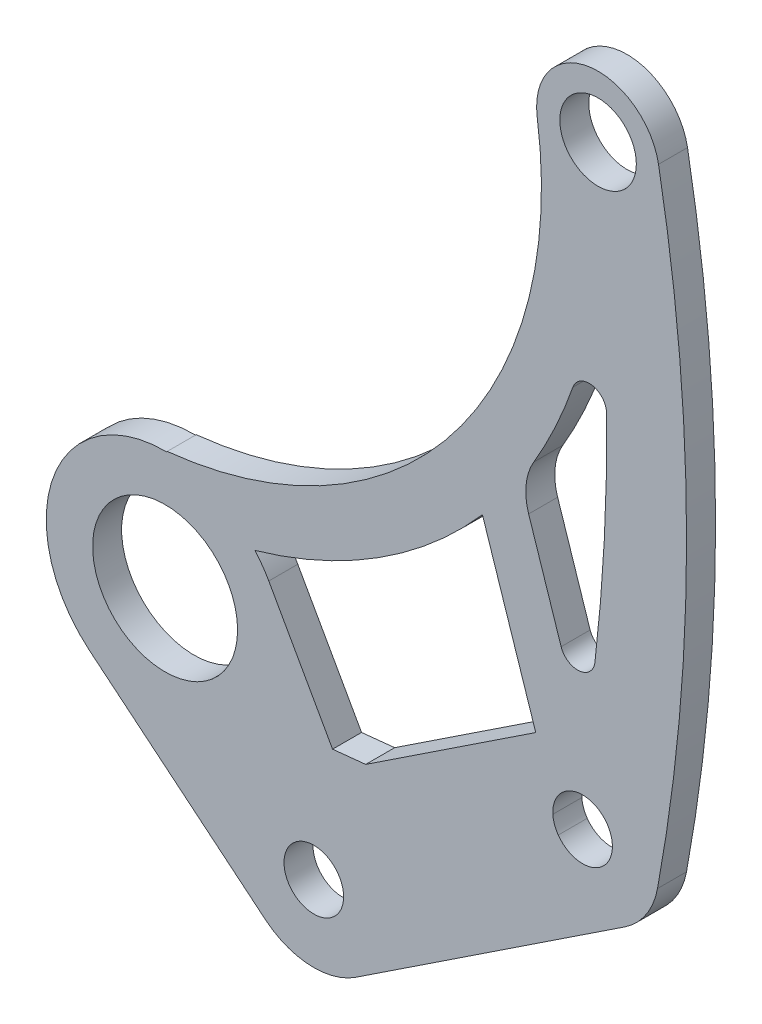
ISO-10303-21;
HEADER;
FILE_DESCRIPTION(('STEP AP214'),'2;1');
FILE_NAME('part.step','',(''),(''),'','','');
FILE_SCHEMA(('AUTOMOTIVE_DESIGN { 1 0 10303 214 1 1 1 1 }'));
ENDSEC;
DATA;
#1=APPLICATION_CONTEXT('core data for automotive mechanical design processes');
#2=APPLICATION_PROTOCOL_DEFINITION('international standard','automotive_design',2000,#1);
#3=PRODUCT_CONTEXT('',#1,'mechanical');
#4=PRODUCT('Part','Part','',(#3));
#5=PRODUCT_RELATED_PRODUCT_CATEGORY('part','',(#4));
#6=PRODUCT_DEFINITION_FORMATION('','',#4);
#7=PRODUCT_DEFINITION_CONTEXT('part definition',#1,'design');
#8=PRODUCT_DEFINITION('design','',#6,#7);
#9=PRODUCT_DEFINITION_SHAPE('','',#8);
#10=(LENGTH_UNIT() NAMED_UNIT(*) SI_UNIT(.MILLI.,.METRE.));
#11=(NAMED_UNIT(*) PLANE_ANGLE_UNIT() SI_UNIT($,.RADIAN.));
#12=(NAMED_UNIT(*) SI_UNIT($,.STERADIAN.) SOLID_ANGLE_UNIT());
#13=UNCERTAINTY_MEASURE_WITH_UNIT(LENGTH_MEASURE(1.E-05),#10,'distance_accuracy_value','');
#14=(GEOMETRIC_REPRESENTATION_CONTEXT(3) GLOBAL_UNCERTAINTY_ASSIGNED_CONTEXT((#13)) GLOBAL_UNIT_ASSIGNED_CONTEXT((#10,
#11,#12)) REPRESENTATION_CONTEXT('',''));
#15=CARTESIAN_POINT('',(0.,0.,0.));
#16=DIRECTION('',(0.,0.,1.));
#17=DIRECTION('',(1.,0.,0.));
#18=AXIS2_PLACEMENT_3D('',#15,#16,#17);
#19=CARTESIAN_POINT('',(45.72,0.,3.175));
#20=DIRECTION('',(0.,0.,-1.));
#21=DIRECTION('',(-1.,0.,0.));
#22=AXIS2_PLACEMENT_3D('',#19,#20,#21);
#23=CYLINDRICAL_SURFACE('',#22,3.2639);
#24=CARTESIAN_POINT('',(45.72,0.,0.));
#25=DIRECTION('',(0.,0.,1.));
#26=DIRECTION('',(1.,0.,0.));
#27=AXIS2_PLACEMENT_3D('',#24,#25,#26);
#28=CIRCLE('',#27,3.2639);
#29=CARTESIAN_POINT('',(42.4625763798194,-0.205510507492002,0.));
#30=VERTEX_POINT('',#29);
#31=CARTESIAN_POINT('',(43.0519360241002,-1.88002069948861,0.));
#32=VERTEX_POINT('',#31);
#33=EDGE_CURVE('E376',#30,#32,#28,.T.);
#34=ORIENTED_EDGE('',*,*,#33,.F.);
#35=DIRECTION('',(0.,0.,1.));
#36=VECTOR('',#35,1.);
#37=CARTESIAN_POINT('',(42.4625763798194,-0.205510507492002,3.175));
#38=LINE('',#37,#36);
#39=CARTESIAN_POINT('',(42.4625763798194,-0.205510507492002,3.175));
#40=VERTEX_POINT('',#39);
#41=EDGE_CURVE('E460',#30,#40,#38,.T.);
#42=ORIENTED_EDGE('',*,*,#41,.T.);
#43=CARTESIAN_POINT('',(45.72,0.,3.175));
#44=DIRECTION('',(0.,0.,1.));
#45=DIRECTION('',(1.,0.,0.));
#46=AXIS2_PLACEMENT_3D('',#43,#44,#45);
#47=CIRCLE('',#46,3.2639);
#48=CARTESIAN_POINT('',(43.0519360241002,-1.88002069948861,3.175));
#49=VERTEX_POINT('',#48);
#50=EDGE_CURVE('E293',#40,#49,#47,.T.);
#51=ORIENTED_EDGE('',*,*,#50,.T.);
#52=DIRECTION('',(0.,0.,1.));
#53=VECTOR('',#52,1.);
#54=CARTESIAN_POINT('',(43.0519360241002,-1.88002069948861,3.175));
#55=LINE('',#54,#53);
#56=EDGE_CURVE('E424',#32,#49,#55,.T.);
#57=ORIENTED_EDGE('',*,*,#56,.F.);
#58=EDGE_LOOP('',(#34,#42,#51,#57));
#59=FACE_BOUND('',#58,.T.);
#60=ADVANCED_FACE('F51',(#59),#23,.F.);
#61=CARTESIAN_POINT('',(48.9774236201806,0.205510507492002,3.175));
#62=VERTEX_POINT('',#61);
#63=EDGE_CURVE('E294',#49,#62,#47,.T.);
#64=ORIENTED_EDGE('',*,*,#63,.T.);
#65=DIRECTION('',(0.,0.,-1.));
#66=VECTOR('',#65,1.);
#67=CARTESIAN_POINT('',(48.9774236201806,0.205510507492002,3.175));
#68=LINE('',#67,#66);
#69=CARTESIAN_POINT('',(48.9774236201806,0.205510507492002,0.));
#70=VERTEX_POINT('',#69);
#71=EDGE_CURVE('E457',#62,#70,#68,.T.);
#72=ORIENTED_EDGE('',*,*,#71,.T.);
#73=EDGE_CURVE('E377',#32,#70,#28,.T.);
#74=ORIENTED_EDGE('',*,*,#73,.F.);
#75=ORIENTED_EDGE('',*,*,#56,.T.);
#76=EDGE_LOOP('',(#64,#72,#74,#75));
#77=FACE_BOUND('',#76,.T.);
#78=ADVANCED_FACE('F523',(#77),#23,.F.);
#79=ORIENTED_EDGE('',*,*,#71,.F.);
#80=CARTESIAN_POINT('',(48.3880639758998,1.88002069948861,3.175));
#81=VERTEX_POINT('',#80);
#82=EDGE_CURVE('E299',#62,#81,#47,.T.);
#83=ORIENTED_EDGE('',*,*,#82,.T.);
#84=DIRECTION('',(0.,0.,-1.));
#85=VECTOR('',#84,1.);
#86=CARTESIAN_POINT('',(48.3880639758998,1.88002069948861,3.175));
#87=LINE('',#86,#85);
#88=CARTESIAN_POINT('',(48.3880639758998,1.88002069948861,0.));
#89=VERTEX_POINT('',#88);
#90=EDGE_CURVE('E453',#81,#89,#87,.T.);
#91=ORIENTED_EDGE('',*,*,#90,.T.);
#92=EDGE_CURVE('E382',#70,#89,#28,.T.);
#93=ORIENTED_EDGE('',*,*,#92,.F.);
#94=EDGE_LOOP('',(#79,#83,#91,#93));
#95=FACE_BOUND('',#94,.T.);
#96=ADVANCED_FACE('F528',(#95),#23,.F.);
#97=CARTESIAN_POINT('',(-142.138533342949,38.656045003802,3.175));
#98=DIRECTION('',(0.,0.,-1.));
#99=DIRECTION('',(-1.,0.,0.));
#100=AXIS2_PLACEMENT_3D('',#97,#98,#99);
#101=CYLINDRICAL_SURFACE('',#100,190.5);
#102=CARTESIAN_POINT('',(-142.138533342949,38.656045003802,0.));
#103=DIRECTION('',(0.,0.,1.));
#104=DIRECTION('',(1.,0.,0.));
#105=AXIS2_PLACEMENT_3D('',#102,#103,#104);
#106=CIRCLE('',#105,190.5);
#107=CARTESIAN_POINT('',(47.0702030784157,16.5132343910918,0.));
#108=VERTEX_POINT('',#107);
#109=CARTESIAN_POINT('',(48.3497321227549,40.7704526909221,0.));
#110=VERTEX_POINT('',#109);
#111=EDGE_CURVE('E381',#108,#110,#106,.T.);
#112=ORIENTED_EDGE('',*,*,#111,.F.);
#113=DIRECTION('',(0.,0.,-1.));
#114=VECTOR('',#113,1.);
#115=CARTESIAN_POINT('',(47.0702030784158,16.5132343910918,3.175));
#116=LINE('',#115,#114);
#117=CARTESIAN_POINT('',(47.0702030784157,16.5132343910918,3.175));
#118=VERTEX_POINT('',#117);
#119=EDGE_CURVE('E471',#108,#118,#116,.F.);
#120=ORIENTED_EDGE('',*,*,#119,.T.);
#121=CARTESIAN_POINT('',(-142.138533342949,38.656045003802,3.175));
#122=DIRECTION('',(0.,0.,1.));
#123=DIRECTION('',(1.,0.,0.));
#124=AXIS2_PLACEMENT_3D('',#121,#122,#123);
#125=CIRCLE('',#124,190.5);
#126=CARTESIAN_POINT('',(48.3497321227549,40.7704526909221,3.175));
#127=VERTEX_POINT('',#126);
#128=EDGE_CURVE('E298',#118,#127,#125,.T.);
#129=ORIENTED_EDGE('',*,*,#128,.T.);
#130=DIRECTION('',(0.,0.,-1.));
#131=VECTOR('',#130,1.);
#132=CARTESIAN_POINT('',(48.3497321227549,40.7704526909221,3.175));
#133=LINE('',#132,#131);
#134=EDGE_CURVE('E467',#127,#110,#133,.T.);
#135=ORIENTED_EDGE('',*,*,#134,.T.);
#136=EDGE_LOOP('',(#112,#120,#129,#135));
#137=FACE_BOUND('',#136,.T.);
#138=ADVANCED_FACE('F583',(#137),#101,.F.);
#139=CARTESIAN_POINT('',(43.9242602583384,14.4500573911322,3.175));
#140=DIRECTION('',(0.949917524329056,0.312500715155273,0.));
#141=DIRECTION('',(-0.312500715155273,0.949917524329056,0.));
#142=AXIS2_PLACEMENT_3D('',#139,#140,#141);
#143=PLANE('',#142);
#144=DIRECTION('',(0.312500715155273,-0.949917524329056,0.));
#145=VECTOR('',#144,1.);
#146=CARTESIAN_POINT('',(43.9242602583384,14.4500573911322,0.));
#147=LINE('',#146,#145);
#148=CARTESIAN_POINT('',(39.8116959434713,26.9511389028385,0.));
#149=VERTEX_POINT('',#148);
#150=CARTESIAN_POINT('',(43.3685228303553,16.1393486348481,0.));
#151=VERTEX_POINT('',#150);
#152=EDGE_CURVE('E387',#149,#151,#147,.T.);
#153=ORIENTED_EDGE('',*,*,#152,.F.);
#154=DIRECTION('',(0.,0.,-1.));
#155=VECTOR('',#154,1.);
#156=CARTESIAN_POINT('',(39.8116959434713,26.9511389028385,3.175));
#157=LINE('',#156,#155);
#158=CARTESIAN_POINT('',(39.8116959434713,26.9511389028385,3.175));
#159=VERTEX_POINT('',#158);
#160=EDGE_CURVE('E73',#149,#159,#157,.F.);
#161=ORIENTED_EDGE('',*,*,#160,.T.);
#162=DIRECTION('',(0.312500715155273,-0.949917524329056,0.));
#163=VECTOR('',#162,1.);
#164=CARTESIAN_POINT('',(43.9242602583384,14.4500573911322,3.175));
#165=LINE('',#164,#163);
#166=CARTESIAN_POINT('',(43.3685228303553,16.1393486348481,3.175));
#167=VERTEX_POINT('',#166);
#168=EDGE_CURVE('E304',#159,#167,#165,.T.);
#169=ORIENTED_EDGE('',*,*,#168,.T.);
#170=DIRECTION('',(0.,0.,1.));
#171=VECTOR('',#170,1.);
#172=CARTESIAN_POINT('',(43.3685228303553,16.1393486348481,0.));
#173=LINE('',#172,#171);
#174=EDGE_CURVE('E463',#167,#151,#173,.F.);
#175=ORIENTED_EDGE('',*,*,#174,.T.);
#176=EDGE_LOOP('',(#153,#161,#169,#175));
#177=FACE_BOUND('',#176,.T.);
#178=ADVANCED_FACE('F586',(#177),#143,.T.);
#179=CARTESIAN_POINT('',(0.811388888888889,-7.89592010604133,3.175));
#180=DIRECTION('',(-0.102222222222222,0.994761588162687,0.));
#181=DIRECTION('',(-0.994761588162687,-0.102222222222222,0.));
#182=AXIS2_PLACEMENT_3D('',#179,#180,#181);
#183=PLANE('',#182);
#184=DIRECTION('',(0.994761588162687,0.102222222222222,0.));
#185=VECTOR('',#184,1.);
#186=CARTESIAN_POINT('',(0.811388888888889,-7.89592010604133,0.));
#187=LINE('',#186,#185);
#188=CARTESIAN_POINT('',(18.3396561244522,-6.09470617715044,0.));
#189=VERTEX_POINT('',#188);
#190=CARTESIAN_POINT('',(21.96746643693,-5.72191048785657,0.));
#191=VERTEX_POINT('',#190);
#192=EDGE_CURVE('E352',#189,#191,#187,.T.);
#193=ORIENTED_EDGE('',*,*,#192,.F.);
#194=DIRECTION('',(0.,0.,-1.));
#195=VECTOR('',#194,1.);
#196=CARTESIAN_POINT('',(18.3396561244522,-6.09470617715044,3.175));
#197=LINE('',#196,#195);
#198=CARTESIAN_POINT('',(18.3396561244522,-6.09470617715044,3.175));
#199=VERTEX_POINT('',#198);
#200=EDGE_CURVE('E421',#199,#189,#197,.T.);
#201=ORIENTED_EDGE('',*,*,#200,.F.);
#202=DIRECTION('',(0.994761588162687,0.102222222222222,0.));
#203=VECTOR('',#202,1.);
#204=CARTESIAN_POINT('',(0.811388888888889,-7.89592010604133,3.175));
#205=LINE('',#204,#203);
#206=CARTESIAN_POINT('',(21.96746643693,-5.72191048785657,3.175));
#207=VERTEX_POINT('',#206);
#208=EDGE_CURVE('E270',#199,#207,#205,.T.);
#209=ORIENTED_EDGE('',*,*,#208,.T.);
#210=DIRECTION('',(0.,0.,-1.));
#211=VECTOR('',#210,1.);
#212=CARTESIAN_POINT('',(21.96746643693,-5.72191048785657,3.175));
#213=LINE('',#212,#211);
#214=EDGE_CURVE('E240',#207,#191,#213,.T.);
#215=ORIENTED_EDGE('',*,*,#214,.T.);
#216=EDGE_LOOP('',(#193,#201,#209,#215));
#217=FACE_BOUND('',#216,.T.);
#218=ADVANCED_FACE('F592',(#217),#183,.T.);
#219=CARTESIAN_POINT('',(11.3551442971774,6.3652183183516,3.175));
#220=DIRECTION('',(0.872298390411173,0.488973944179112,0.));
#221=DIRECTION('',(-0.488973944179112,0.872298390411173,0.));
#222=AXIS2_PLACEMENT_3D('',#219,#220,#221);
#223=PLANE('',#222);
#224=DIRECTION('',(0.488973944179112,-0.872298390411173,0.));
#225=VECTOR('',#224,1.);
#226=CARTESIAN_POINT('',(11.3551442971774,6.3652183183516,0.));
#227=LINE('',#226,#225);
#228=CARTESIAN_POINT('',(11.3551442971774,6.3652183183516,0.));
#229=VERTEX_POINT('',#228);
#230=EDGE_CURVE('E356',#229,#189,#227,.T.);
#231=ORIENTED_EDGE('',*,*,#230,.F.);
#232=DIRECTION('',(0.,0.,-1.));
#233=VECTOR('',#232,1.);
#234=CARTESIAN_POINT('',(11.3551442971774,6.3652183183516,3.175));
#235=LINE('',#234,#233);
#236=CARTESIAN_POINT('',(11.3551442971774,6.3652183183516,3.175));
#237=VERTEX_POINT('',#236);
#238=EDGE_CURVE('E418',#237,#229,#235,.T.);
#239=ORIENTED_EDGE('',*,*,#238,.F.);
#240=DIRECTION('',(0.488973944179112,-0.872298390411173,0.));
#241=VECTOR('',#240,1.);
#242=CARTESIAN_POINT('',(11.3551442971774,6.3652183183516,3.175));
#243=LINE('',#242,#241);
#244=EDGE_CURVE('E274',#237,#199,#243,.T.);
#245=ORIENTED_EDGE('',*,*,#244,.T.);
#246=ORIENTED_EDGE('',*,*,#200,.T.);
#247=EDGE_LOOP('',(#231,#239,#245,#246));
#248=FACE_BOUND('',#247,.T.);
#249=ADVANCED_FACE('F702',(#248),#223,.T.);
#250=CARTESIAN_POINT('',(0.,0.,3.175));
#251=DIRECTION('',(0.,0.,-1.));
#252=DIRECTION('',(-1.,0.,0.));
#253=AXIS2_PLACEMENT_3D('',#250,#251,#252);
#254=CYLINDRICAL_SURFACE('',#253,13.0175);
#255=CARTESIAN_POINT('',(0.,0.,0.));
#256=DIRECTION('',(0.,0.,1.));
#257=DIRECTION('',(1.,0.,0.));
#258=AXIS2_PLACEMENT_3D('',#255,#256,#257);
#259=CIRCLE('',#258,13.0175);
#260=CARTESIAN_POINT('',(9.84885975052512,8.51206601621993,0.));
#261=VERTEX_POINT('',#260);
#262=EDGE_CURVE('E360',#229,#261,#259,.T.);
#263=ORIENTED_EDGE('',*,*,#262,.T.);
#264=DIRECTION('',(0.,0.,-1.));
#265=VECTOR('',#264,1.);
#266=CARTESIAN_POINT('',(9.84885975052512,8.51206601621993,3.175));
#267=LINE('',#266,#265);
#268=CARTESIAN_POINT('',(9.84885975052512,8.51206601621993,3.175));
#269=VERTEX_POINT('',#268);
#270=EDGE_CURVE('E414',#269,#261,#267,.T.);
#271=ORIENTED_EDGE('',*,*,#270,.F.);
#272=CARTESIAN_POINT('',(0.,0.,3.175));
#273=DIRECTION('',(0.,0.,1.));
#274=DIRECTION('',(1.,0.,0.));
#275=AXIS2_PLACEMENT_3D('',#272,#273,#274);
#276=CIRCLE('',#275,13.0175);
#277=EDGE_CURVE('E278',#237,#269,#276,.T.);
#278=ORIENTED_EDGE('',*,*,#277,.F.);
#279=ORIENTED_EDGE('',*,*,#238,.T.);
#280=EDGE_LOOP('',(#263,#271,#278,#279));
#281=FACE_BOUND('',#280,.T.);
#282=ADVANCED_FACE('F711',(#281),#254,.T.);
#283=CARTESIAN_POINT('',(-4.50533240745612,58.5644592406378,3.175));
#284=DIRECTION('',(0.,0.,-1.));
#285=DIRECTION('',(-1.,0.,0.));
#286=AXIS2_PLACEMENT_3D('',#283,#284,#285);
#287=CYLINDRICAL_SURFACE('',#286,52.07);
#288=CARTESIAN_POINT('',(-4.50533240745612,58.5644592406378,0.));
#289=DIRECTION('',(0.,0.,1.));
#290=DIRECTION('',(1.,0.,0.));
#291=AXIS2_PLACEMENT_3D('',#288,#289,#290);
#292=CIRCLE('',#291,52.07);
#293=CARTESIAN_POINT('',(34.7498990240676,24.3546403978332,0.));
#294=VERTEX_POINT('',#293);
#295=EDGE_CURVE('E364',#261,#294,#292,.T.);
#296=ORIENTED_EDGE('',*,*,#295,.T.);
#297=DIRECTION('',(0.,0.,-1.));
#298=VECTOR('',#297,1.);
#299=CARTESIAN_POINT('',(34.7498990240676,24.3546403978332,3.175));
#300=LINE('',#299,#298);
#301=CARTESIAN_POINT('',(34.7498990240676,24.3546403978332,3.175));
#302=VERTEX_POINT('',#301);
#303=EDGE_CURVE('E410',#302,#294,#300,.T.);
#304=ORIENTED_EDGE('',*,*,#303,.F.);
#305=CARTESIAN_POINT('',(-4.50533240745612,58.5644592406378,3.175));
#306=DIRECTION('',(0.,0.,1.));
#307=DIRECTION('',(1.,0.,0.));
#308=AXIS2_PLACEMENT_3D('',#305,#306,#307);
#309=CIRCLE('',#308,52.07);
#310=EDGE_CURVE('E282',#269,#302,#309,.T.);
#311=ORIENTED_EDGE('',*,*,#310,.F.);
#312=ORIENTED_EDGE('',*,*,#270,.T.);
#313=EDGE_LOOP('',(#296,#304,#311,#312));
#314=FACE_BOUND('',#313,.T.);
#315=ADVANCED_FACE('F721',(#314),#287,.T.);
#316=CARTESIAN_POINT('',(38.586011370491,12.6938979852854,3.175));
#317=DIRECTION('',(0.949917524329056,0.312500715155272,0.));
#318=DIRECTION('',(-0.312500715155272,0.949917524329057,0.));
#319=AXIS2_PLACEMENT_3D('',#316,#317,#318);
#320=PLANE('',#319);
#321=DIRECTION('',(0.312500715155272,-0.949917524329057,0.));
#322=VECTOR('',#321,1.);
#323=CARTESIAN_POINT('',(38.586011370491,12.6938979852854,0.));
#324=LINE('',#323,#322);
#325=CARTESIAN_POINT('',(40.5878173621273,6.60895001703049,0.));
#326=VERTEX_POINT('',#325);
#327=EDGE_CURVE('E368',#294,#326,#324,.T.);
#328=ORIENTED_EDGE('',*,*,#327,.T.);
#329=DIRECTION('',(0.,0.,-1.));
#330=VECTOR('',#329,1.);
#331=CARTESIAN_POINT('',(40.5878173621273,6.60895001703049,3.175));
#332=LINE('',#331,#330);
#333=CARTESIAN_POINT('',(40.5878173621273,6.60895001703049,3.175));
#334=VERTEX_POINT('',#333);
#335=EDGE_CURVE('E406',#334,#326,#332,.T.);
#336=ORIENTED_EDGE('',*,*,#335,.F.);
#337=DIRECTION('',(0.312500715155272,-0.949917524329057,0.));
#338=VECTOR('',#337,1.);
#339=CARTESIAN_POINT('',(38.586011370491,12.6938979852854,3.175));
#340=LINE('',#339,#338);
#341=EDGE_CURVE('E286',#302,#334,#340,.T.);
#342=ORIENTED_EDGE('',*,*,#341,.F.);
#343=ORIENTED_EDGE('',*,*,#303,.T.);
#344=EDGE_LOOP('',(#328,#336,#342,#343));
#345=FACE_BOUND('',#344,.T.);
#346=ADVANCED_FACE('F640',(#345),#320,.F.);
#347=CARTESIAN_POINT('',(16.2846569382907,-19.4928178671576,3.175));
#348=DIRECTION('',(0.,0.,-1.));
#349=DIRECTION('',(-1.,0.,0.));
#350=AXIS2_PLACEMENT_3D('',#347,#348,#349);
#351=CYLINDRICAL_SURFACE('',#350,8.3439);
#352=CARTESIAN_POINT('',(16.2846569382907,-19.4928178671576,0.));
#353=DIRECTION('',(0.,0.,1.));
#354=DIRECTION('',(1.,0.,0.));
#355=AXIS2_PLACEMENT_3D('',#352,#353,#354);
#356=CIRCLE('',#355,8.3439);
#357=CARTESIAN_POINT('',(10.974906006495,-25.9292153263187,0.));
#358=VERTEX_POINT('',#357);
#359=CARTESIAN_POINT('',(20.8916054969986,-26.4495909831518,0.));
#360=VERTEX_POINT('',#359);
#361=EDGE_CURVE('E235',#358,#360,#356,.T.);
#362=ORIENTED_EDGE('',*,*,#361,.T.);
#363=DIRECTION('',(0.,0.,-1.));
#364=VECTOR('',#363,1.);
#365=CARTESIAN_POINT('',(20.8916054969986,-26.4495909831518,3.175));
#366=LINE('',#365,#364);
#367=CARTESIAN_POINT('',(20.8916054969986,-26.4495909831518,3.175));
#368=VERTEX_POINT('',#367);
#369=EDGE_CURVE('E232',#368,#360,#366,.T.);
#370=ORIENTED_EDGE('',*,*,#369,.F.);
#371=CARTESIAN_POINT('',(16.2846569382907,-19.4928178671576,3.175));
#372=DIRECTION('',(0.,0.,1.));
#373=DIRECTION('',(1.,0.,0.));
#374=AXIS2_PLACEMENT_3D('',#371,#372,#373);
#375=CIRCLE('',#374,8.3439);
#376=CARTESIAN_POINT('',(10.974906006495,-25.9292153263187,3.175));
#377=VERTEX_POINT('',#376);
#378=EDGE_CURVE('E217',#377,#368,#375,.T.);
#379=ORIENTED_EDGE('',*,*,#378,.F.);
#380=DIRECTION('',(0.,0.,-1.));
#381=VECTOR('',#380,1.);
#382=CARTESIAN_POINT('',(10.974906006495,-25.9292153263187,3.175));
#383=LINE('',#382,#381);
#384=EDGE_CURVE('E322',#377,#358,#383,.T.);
#385=ORIENTED_EDGE('',*,*,#384,.T.);
#386=EDGE_LOOP('',(#362,#370,#379,#385));
#387=FACE_BOUND('',#386,.T.);
#388=ADVANCED_FACE('F233',(#387),#351,.T.);
#389=CARTESIAN_POINT('',(18.5447658322115,-28.0037267054097,3.175));
#390=DIRECTION('',(0.5521337214861,-0.833755571854191,0.));
#391=DIRECTION('',(0.833755571854191,0.5521337214861,0.));
#392=AXIS2_PLACEMENT_3D('',#389,#390,#391);
#393=PLANE('',#392);
#394=DIRECTION('',(-0.833755571854191,-0.5521337214861,0.));
#395=VECTOR('',#394,1.);
#396=CARTESIAN_POINT('',(18.5447658322115,-28.0037267054097,0.));
#397=LINE('',#396,#395);
#398=CARTESIAN_POINT('',(50.3269485587079,-6.95677311599419,0.));
#399=VERTEX_POINT('',#398);
#400=EDGE_CURVE('E325',#399,#360,#397,.T.);
#401=ORIENTED_EDGE('',*,*,#400,.F.);
#402=DIRECTION('',(0.,0.,-1.));
#403=VECTOR('',#402,1.);
#404=CARTESIAN_POINT('',(50.3269485587079,-6.95677311599419,3.175));
#405=LINE('',#404,#403);
#406=CARTESIAN_POINT('',(50.3269485587079,-6.95677311599419,3.175));
#407=VERTEX_POINT('',#406);
#408=EDGE_CURVE('E241',#407,#399,#405,.T.);
#409=ORIENTED_EDGE('',*,*,#408,.F.);
#410=DIRECTION('',(-0.833755571854191,-0.5521337214861,0.));
#411=VECTOR('',#410,1.);
#412=CARTESIAN_POINT('',(18.5447658322115,-28.0037267054097,3.175));
#413=LINE('',#412,#411);
#414=EDGE_CURVE('E222',#407,#368,#413,.T.);
#415=ORIENTED_EDGE('',*,*,#414,.T.);
#416=ORIENTED_EDGE('',*,*,#369,.T.);
#417=EDGE_LOOP('',(#401,#409,#415,#416));
#418=FACE_BOUND('',#417,.T.);
#419=ADVANCED_FACE('F243',(#418),#393,.T.);
#420=CARTESIAN_POINT('',(45.72,0.,3.175));
#421=DIRECTION('',(0.,0.,-1.));
#422=DIRECTION('',(-1.,0.,0.));
#423=AXIS2_PLACEMENT_3D('',#420,#421,#422);
#424=CYLINDRICAL_SURFACE('',#423,8.3439);
#425=CARTESIAN_POINT('',(45.72,0.,0.));
#426=DIRECTION('',(0.,0.,1.));
#427=DIRECTION('',(1.,0.,0.));
#428=AXIS2_PLACEMENT_3D('',#425,#426,#427);
#429=CIRCLE('',#428,8.3439);
#430=CARTESIAN_POINT('',(53.9245222927567,-1.51871036002841,0.));
#431=VERTEX_POINT('',#430);
#432=EDGE_CURVE('E328',#399,#431,#429,.T.);
#433=ORIENTED_EDGE('',*,*,#432,.T.);
#434=DIRECTION('',(0.,0.,-1.));
#435=VECTOR('',#434,1.);
#436=CARTESIAN_POINT('',(53.9245222927567,-1.51871036002841,3.175));
#437=LINE('',#436,#435);
#438=CARTESIAN_POINT('',(53.9245222927567,-1.51871036002841,3.175));
#439=VERTEX_POINT('',#438);
#440=EDGE_CURVE('E444',#439,#431,#437,.T.);
#441=ORIENTED_EDGE('',*,*,#440,.F.);
#442=CARTESIAN_POINT('',(45.72,0.,3.175));
#443=DIRECTION('',(0.,0.,1.));
#444=DIRECTION('',(1.,0.,0.));
#445=AXIS2_PLACEMENT_3D('',#442,#443,#444);
#446=CIRCLE('',#445,8.3439);
#447=EDGE_CURVE('E246',#407,#439,#446,.T.);
#448=ORIENTED_EDGE('',*,*,#447,.F.);
#449=ORIENTED_EDGE('',*,*,#408,.T.);
#450=EDGE_LOOP('',(#433,#441,#448,#449));
#451=FACE_BOUND('',#450,.T.);
#452=ADVANCED_FACE('F631',(#451),#424,.T.);
#453=CARTESIAN_POINT('',(-133.393338272466,33.1550421520357,3.175));
#454=DIRECTION('',(0.,0.,-1.));
#455=DIRECTION('',(-1.,0.,0.));
#456=AXIS2_PLACEMENT_3D('',#453,#454,#455);
#457=CYLINDRICAL_SURFACE('',#456,190.5);
#458=CARTESIAN_POINT('',(-133.393338272466,33.1550421520357,0.));
#459=DIRECTION('',(0.,0.,1.));
#460=DIRECTION('',(1.,0.,0.));
#461=AXIS2_PLACEMENT_3D('',#458,#459,#460);
#462=CIRCLE('',#461,190.5);
#463=CARTESIAN_POINT('',(54.0358306347205,67.2219857008992,0.));
#464=VERTEX_POINT('',#463);
#465=EDGE_CURVE('E331',#431,#464,#462,.T.);
#466=ORIENTED_EDGE('',*,*,#465,.T.);
#467=DIRECTION('',(0.,0.,-1.));
#468=VECTOR('',#467,1.);
#469=CARTESIAN_POINT('',(54.0358306347205,67.2219857008992,3.175));
#470=LINE('',#469,#468);
#471=CARTESIAN_POINT('',(54.0358306347205,67.2219857008992,3.175));
#472=VERTEX_POINT('',#471);
#473=EDGE_CURVE('E440',#472,#464,#470,.T.);
#474=ORIENTED_EDGE('',*,*,#473,.F.);
#475=CARTESIAN_POINT('',(-133.393338272466,33.1550421520357,3.175));
#476=DIRECTION('',(0.,0.,1.));
#477=DIRECTION('',(1.,0.,0.));
#478=AXIS2_PLACEMENT_3D('',#475,#476,#477);
#479=CIRCLE('',#478,190.5);
#480=EDGE_CURVE('E249',#439,#472,#479,.T.);
#481=ORIENTED_EDGE('',*,*,#480,.F.);
#482=ORIENTED_EDGE('',*,*,#440,.T.);
#483=EDGE_LOOP('',(#466,#474,#481,#482));
#484=FACE_BOUND('',#483,.T.);
#485=ADVANCED_FACE('F627',(#484),#457,.T.);
#486=CARTESIAN_POINT('',(47.4133333333333,66.0182870288394,3.175));
#487=DIRECTION('',(0.,0.,-1.));
#488=DIRECTION('',(-1.,0.,0.));
#489=AXIS2_PLACEMENT_3D('',#486,#487,#488);
#490=CYLINDRICAL_SURFACE('',#489,6.73099999999993);
#491=CARTESIAN_POINT('',(47.4133333333333,66.0182870288394,0.));
#492=DIRECTION('',(0.,0.,1.));
#493=DIRECTION('',(1.,0.,0.));
#494=AXIS2_PLACEMENT_3D('',#491,#492,#493);
#495=CIRCLE('',#494,6.73099999999993);
#496=CARTESIAN_POINT('',(40.7506474150239,65.0617425427021,0.));
#497=VERTEX_POINT('',#496);
#498=EDGE_CURVE('E334',#464,#497,#495,.T.);
#499=ORIENTED_EDGE('',*,*,#498,.T.);
#500=DIRECTION('',(0.,0.,-1.));
#501=VECTOR('',#500,1.);
#502=CARTESIAN_POINT('',(40.7506474150239,65.0617425427021,3.175));
#503=LINE('',#502,#501);
#504=CARTESIAN_POINT('',(40.7506474150239,65.0617425427021,3.175));
#505=VERTEX_POINT('',#504);
#506=EDGE_CURVE('E437',#505,#497,#503,.T.);
#507=ORIENTED_EDGE('',*,*,#506,.F.);
#508=CARTESIAN_POINT('',(47.4133333333333,66.0182870288394,3.175));
#509=DIRECTION('',(0.,0.,1.));
#510=DIRECTION('',(1.,0.,0.));
#511=AXIS2_PLACEMENT_3D('',#508,#509,#510);
#512=CIRCLE('',#511,6.73099999999993);
#513=EDGE_CURVE('E254',#472,#505,#512,.T.);
#514=ORIENTED_EDGE('',*,*,#513,.F.);
#515=ORIENTED_EDGE('',*,*,#473,.T.);
#516=EDGE_LOOP('',(#499,#507,#514,#515));
#517=FACE_BOUND('',#516,.T.);
#518=ADVANCED_FACE('F623',(#517),#490,.T.);
#519=CARTESIAN_POINT('',(-4.50533240745612,58.5644592406378,3.175));
#520=DIRECTION('',(0.,0.,-1.));
#521=DIRECTION('',(-1.,0.,0.));
#522=AXIS2_PLACEMENT_3D('',#519,#520,#521);
#523=CYLINDRICAL_SURFACE('',#522,45.72);
#524=CARTESIAN_POINT('',(-4.50533240745612,58.5644592406378,0.));
#525=DIRECTION('',(0.,0.,1.));
#526=DIRECTION('',(1.,0.,0.));
#527=AXIS2_PLACEMENT_3D('',#524,#525,#526);
#528=CIRCLE('',#527,45.72);
#529=CARTESIAN_POINT('',(0.230104831543752,13.0903563450831,0.));
#530=VERTEX_POINT('',#529);
#531=EDGE_CURVE('E338',#530,#497,#528,.T.);
#532=ORIENTED_EDGE('',*,*,#531,.F.);
#533=DIRECTION('',(0.,0.,-1.));
#534=VECTOR('',#533,1.);
#535=CARTESIAN_POINT('',(0.230104831543752,13.0903563450831,3.175));
#536=LINE('',#535,#534);
#537=CARTESIAN_POINT('',(0.230104831543752,13.0903563450831,3.175));
#538=VERTEX_POINT('',#537);
#539=EDGE_CURVE('E434',#538,#530,#536,.T.);
#540=ORIENTED_EDGE('',*,*,#539,.F.);
#541=CARTESIAN_POINT('',(-4.50533240745612,58.5644592406378,3.175));
#542=DIRECTION('',(0.,0.,1.));
#543=DIRECTION('',(1.,0.,0.));
#544=AXIS2_PLACEMENT_3D('',#541,#542,#543);
#545=CIRCLE('',#544,45.72);
#546=EDGE_CURVE('E257',#538,#505,#545,.T.);
#547=ORIENTED_EDGE('',*,*,#546,.T.);
#548=ORIENTED_EDGE('',*,*,#506,.T.);
#549=EDGE_LOOP('',(#532,#540,#547,#548));
#550=FACE_BOUND('',#549,.T.);
#551=ADVANCED_FACE('F616',(#550),#523,.F.);
#552=CARTESIAN_POINT('',(-6.2268221741051,4.92245790861365,3.175));
#553=DIRECTION('',(-0.784481533745524,0.620152177463137,0.));
#554=DIRECTION('',(-0.620152177463137,-0.784481533745524,0.));
#555=AXIS2_PLACEMENT_3D('',#552,#553,#554);
#556=PLANE('',#555);
#557=DIRECTION('',(0.620152177463137,0.784481533745524,0.));
#558=VECTOR('',#557,1.);
#559=CARTESIAN_POINT('',(-6.2268221741051,4.92245790861365,0.));
#560=LINE('',#559,#558);
#561=CARTESIAN_POINT('',(0.171615761059916,13.0163687056166,0.));
#562=VERTEX_POINT('',#561);
#563=EDGE_CURVE('E342',#562,#530,#560,.T.);
#564=ORIENTED_EDGE('',*,*,#563,.F.);
#565=DIRECTION('',(0.,0.,-1.));
#566=VECTOR('',#565,1.);
#567=CARTESIAN_POINT('',(0.171615761059916,13.0163687056166,3.175));
#568=LINE('',#567,#566);
#569=CARTESIAN_POINT('',(0.171615761059916,13.0163687056166,3.175));
#570=VERTEX_POINT('',#569);
#571=EDGE_CURVE('E431',#570,#562,#568,.T.);
#572=ORIENTED_EDGE('',*,*,#571,.F.);
#573=DIRECTION('',(0.620152177463137,0.784481533745524,0.));
#574=VECTOR('',#573,1.);
#575=CARTESIAN_POINT('',(-6.2268221741051,4.92245790861365,3.175));
#576=LINE('',#575,#574);
#577=EDGE_CURVE('E261',#570,#538,#576,.T.);
#578=ORIENTED_EDGE('',*,*,#577,.T.);
#579=ORIENTED_EDGE('',*,*,#539,.T.);
#580=EDGE_LOOP('',(#564,#572,#578,#579));
#581=FACE_BOUND('',#580,.T.);
#582=ADVANCED_FACE('F605',(#581),#556,.T.);
#583=CARTESIAN_POINT('',(0.,0.,3.175));
#584=DIRECTION('',(0.,0.,-1.));
#585=DIRECTION('',(-1.,0.,0.));
#586=AXIS2_PLACEMENT_3D('',#583,#584,#585);
#587=CYLINDRICAL_SURFACE('',#586,13.0175);
#588=CARTESIAN_POINT('',(0.,0.,0.));
#589=DIRECTION('',(0.,0.,1.));
#590=DIRECTION('',(1.,0.,0.));
#591=AXIS2_PLACEMENT_3D('',#588,#589,#590);
#592=CIRCLE('',#591,13.0175);
#593=CARTESIAN_POINT('',(-8.2838579986158,-10.0415637680975,0.));
#594=VERTEX_POINT('',#593);
#595=EDGE_CURVE('E346',#562,#594,#592,.T.);
#596=ORIENTED_EDGE('',*,*,#595,.T.);
#597=DIRECTION('',(0.,0.,-1.));
#598=VECTOR('',#597,1.);
#599=CARTESIAN_POINT('',(-8.2838579986158,-10.0415637680975,3.175));
#600=LINE('',#599,#598);
#601=CARTESIAN_POINT('',(-8.2838579986158,-10.0415637680975,3.175));
#602=VERTEX_POINT('',#601);
#603=EDGE_CURVE('E427',#602,#594,#600,.T.);
#604=ORIENTED_EDGE('',*,*,#603,.F.);
#605=CARTESIAN_POINT('',(0.,0.,3.175));
#606=DIRECTION('',(0.,0.,1.));
#607=DIRECTION('',(1.,0.,0.));
#608=AXIS2_PLACEMENT_3D('',#605,#606,#607);
#609=CIRCLE('',#608,13.0175);
#610=EDGE_CURVE('E265',#570,#602,#609,.T.);
#611=ORIENTED_EDGE('',*,*,#610,.F.);
#612=ORIENTED_EDGE('',*,*,#571,.T.);
#613=EDGE_LOOP('',(#596,#604,#611,#612));
#614=FACE_BOUND('',#613,.T.);
#615=ADVANCED_FACE('F600',(#614),#587,.T.);
#616=CARTESIAN_POINT('',(0.,0.,3.175));
#617=DIRECTION('',(0.,0.,-1.));
#618=DIRECTION('',(-1.,0.,0.));
#619=AXIS2_PLACEMENT_3D('',#616,#617,#618);
#620=CYLINDRICAL_SURFACE('',#619,7.9375);
#621=CARTESIAN_POINT('',(0.,0.,3.175));
#622=DIRECTION('',(0.,0.,1.));
#623=DIRECTION('',(1.,0.,0.));
#624=AXIS2_PLACEMENT_3D('',#621,#622,#623);
#625=CIRCLE('',#624,7.9375);
#626=CARTESIAN_POINT('',(7.9375,0.,3.175));
#627=VERTEX_POINT('',#626);
#628=EDGE_CURVE('E314',#627,#627,#625,.T.);
#629=ORIENTED_EDGE('',*,*,#628,.T.);
#630=EDGE_LOOP('',(#629));
#631=FACE_BOUND('',#630,.T.);
#632=CARTESIAN_POINT('',(0.,0.,0.));
#633=DIRECTION('',(0.,0.,1.));
#634=DIRECTION('',(1.,0.,0.));
#635=AXIS2_PLACEMENT_3D('',#632,#633,#634);
#636=CIRCLE('',#635,7.9375);
#637=CARTESIAN_POINT('',(7.9375,0.,0.));
#638=VERTEX_POINT('',#637);
#639=EDGE_CURVE('E397',#638,#638,#636,.T.);
#640=ORIENTED_EDGE('',*,*,#639,.F.);
#641=EDGE_LOOP('',(#640));
#642=FACE_BOUND('',#641,.T.);
#643=ADVANCED_FACE('F597',(#631,#642),#620,.F.);
#644=CARTESIAN_POINT('',(47.4133333333333,66.0182870288394,3.175));
#645=DIRECTION('',(0.,0.,-1.));
#646=DIRECTION('',(-1.,0.,0.));
#647=AXIS2_PLACEMENT_3D('',#644,#645,#646);
#648=CYLINDRICAL_SURFACE('',#647,4.1910000000001);
#649=CARTESIAN_POINT('',(47.4133333333333,66.0182870288394,3.175));
#650=DIRECTION('',(0.,0.,1.));
#651=DIRECTION('',(1.,0.,0.));
#652=AXIS2_PLACEMENT_3D('',#649,#650,#651);
#653=CIRCLE('',#652,4.1910000000001);
#654=CARTESIAN_POINT('',(51.6043333333335,66.0182870288394,3.175));
#655=VERTEX_POINT('',#654);
#656=EDGE_CURVE('E310',#655,#655,#653,.T.);
#657=ORIENTED_EDGE('',*,*,#656,.T.);
#658=EDGE_LOOP('',(#657));
#659=FACE_BOUND('',#658,.T.);
#660=CARTESIAN_POINT('',(47.4133333333333,66.0182870288394,0.));
#661=DIRECTION('',(0.,0.,1.));
#662=DIRECTION('',(1.,0.,0.));
#663=AXIS2_PLACEMENT_3D('',#660,#661,#662);
#664=CIRCLE('',#663,4.1910000000001);
#665=CARTESIAN_POINT('',(51.6043333333335,66.0182870288394,0.));
#666=VERTEX_POINT('',#665);
#667=EDGE_CURVE('E393',#666,#666,#664,.T.);
#668=ORIENTED_EDGE('',*,*,#667,.F.);
#669=EDGE_LOOP('',(#668));
#670=FACE_BOUND('',#669,.T.);
#671=ADVANCED_FACE('F580',(#659,#670),#648,.F.);
#672=CARTESIAN_POINT('',(-4.50533240745612,58.5644592406378,3.175));
#673=DIRECTION('',(0.,0.,-1.));
#674=DIRECTION('',(-1.,0.,0.));
#675=AXIS2_PLACEMENT_3D('',#672,#673,#674);
#676=CYLINDRICAL_SURFACE('',#675,52.07);
#677=CARTESIAN_POINT('',(-4.50533240745612,58.5644592406378,3.175));
#678=DIRECTION('',(0.,0.,1.));
#679=DIRECTION('',(1.,0.,0.));
#680=AXIS2_PLACEMENT_3D('',#677,#678,#679);
#681=CIRCLE('',#680,52.07);
#682=CARTESIAN_POINT('',(40.3709543283503,32.1560554871792,3.175));
#683=VERTEX_POINT('',#682);
#684=CARTESIAN_POINT('',(44.646607754843,41.3780786361658,3.175));
#685=VERTEX_POINT('',#684);
#686=EDGE_CURVE('E307',#683,#685,#681,.T.);
#687=ORIENTED_EDGE('',*,*,#686,.F.);
#688=DIRECTION('',(0.,0.,-1.));
#689=VECTOR('',#688,1.);
#690=CARTESIAN_POINT('',(40.3709543283503,32.1560554871792,3.175));
#691=LINE('',#690,#689);
#692=CARTESIAN_POINT('',(40.3709543283503,32.1560554871792,0.));
#693=VERTEX_POINT('',#692);
#694=EDGE_CURVE('E492',#683,#693,#691,.T.);
#695=ORIENTED_EDGE('',*,*,#694,.T.);
#696=CARTESIAN_POINT('',(-4.50533240745612,58.5644592406378,0.));
#697=DIRECTION('',(0.,0.,1.));
#698=DIRECTION('',(1.,0.,0.));
#699=AXIS2_PLACEMENT_3D('',#696,#697,#698);
#700=CIRCLE('',#699,52.07);
#701=CARTESIAN_POINT('',(44.646607754843,41.3780786361658,0.));
#702=VERTEX_POINT('',#701);
#703=EDGE_CURVE('E390',#693,#702,#700,.T.);
#704=ORIENTED_EDGE('',*,*,#703,.T.);
#705=DIRECTION('',(0.,0.,-1.));
#706=VECTOR('',#705,1.);
#707=CARTESIAN_POINT('',(44.646607754843,41.3780786361658,3.175));
#708=LINE('',#707,#706);
#709=EDGE_CURVE('E474',#702,#685,#708,.F.);
#710=ORIENTED_EDGE('',*,*,#709,.T.);
#711=EDGE_LOOP('',(#687,#695,#704,#710));
#712=FACE_BOUND('',#711,.T.);
#713=ADVANCED_FACE('F572',(#712),#676,.T.);
#714=ORIENTED_EDGE('',*,*,#41,.F.);
#715=EDGE_CURVE('E383',#89,#30,#28,.T.);
#716=ORIENTED_EDGE('',*,*,#715,.F.);
#717=ORIENTED_EDGE('',*,*,#90,.F.);
#718=EDGE_CURVE('E300',#81,#40,#47,.T.);
#719=ORIENTED_EDGE('',*,*,#718,.T.);
#720=EDGE_LOOP('',(#714,#716,#717,#719));
#721=FACE_BOUND('',#720,.T.);
#722=ADVANCED_FACE('F532',(#721),#23,.F.);
#723=CARTESIAN_POINT('',(9.33086871479571,-14.0901804734213,3.175));
#724=DIRECTION('',(0.5521337214861,-0.833755571854191,0.));
#725=DIRECTION('',(0.833755571854191,0.5521337214861,0.));
#726=AXIS2_PLACEMENT_3D('',#723,#724,#725);
#727=PLANE('',#726);
#728=DIRECTION('',(-0.833755571854191,-0.5521337214861,0.));
#729=VECTOR('',#728,1.);
#730=CARTESIAN_POINT('',(9.33086871479571,-14.0901804734213,0.));
#731=LINE('',#730,#729);
#732=EDGE_CURVE('E372',#326,#191,#731,.T.);
#733=ORIENTED_EDGE('',*,*,#732,.T.);
#734=ORIENTED_EDGE('',*,*,#214,.F.);
#735=DIRECTION('',(-0.833755571854191,-0.5521337214861,0.));
#736=VECTOR('',#735,1.);
#737=CARTESIAN_POINT('',(9.33086871479571,-14.0901804734213,3.175));
#738=LINE('',#737,#736);
#739=EDGE_CURVE('E290',#334,#207,#738,.T.);
#740=ORIENTED_EDGE('',*,*,#739,.F.);
#741=ORIENTED_EDGE('',*,*,#335,.T.);
#742=EDGE_LOOP('',(#733,#734,#740,#741));
#743=FACE_BOUND('',#742,.T.);
#744=ADVANCED_FACE('F561',(#743),#727,.F.);
#745=CARTESIAN_POINT('',(-8.2838579986158,-10.0415637680975,3.175));
#746=DIRECTION('',(0.636363203273732,0.771389573120609,0.));
#747=DIRECTION('',(-0.771389573120609,0.636363203273732,0.));
#748=AXIS2_PLACEMENT_3D('',#745,#746,#747);
#749=PLANE('',#748);
#750=DIRECTION('',(0.771389573120609,-0.636363203273732,0.));
#751=VECTOR('',#750,1.);
#752=CARTESIAN_POINT('',(-8.2838579986158,-10.0415637680975,0.));
#753=LINE('',#752,#751);
#754=EDGE_CURVE('E349',#594,#358,#753,.T.);
#755=ORIENTED_EDGE('',*,*,#754,.T.);
#756=ORIENTED_EDGE('',*,*,#384,.F.);
#757=DIRECTION('',(0.771389573120609,-0.636363203273732,0.));
#758=VECTOR('',#757,1.);
#759=CARTESIAN_POINT('',(-8.2838579986158,-10.0415637680975,3.175));
#760=LINE('',#759,#758);
#761=EDGE_CURVE('E224',#602,#377,#760,.T.);
#762=ORIENTED_EDGE('',*,*,#761,.F.);
#763=ORIENTED_EDGE('',*,*,#603,.T.);
#764=EDGE_LOOP('',(#755,#756,#762,#763));
#765=FACE_BOUND('',#764,.T.);
#766=ADVANCED_FACE('F552',(#765),#749,.F.);
#767=CARTESIAN_POINT('',(16.2846569382907,-19.4928178671576,3.175));
#768=DIRECTION('',(0.,0.,-1.));
#769=DIRECTION('',(-1.,0.,0.));
#770=AXIS2_PLACEMENT_3D('',#767,#768,#769);
#771=CYLINDRICAL_SURFACE('',#770,3.2639);
#772=CARTESIAN_POINT('',(16.2846569382907,-19.4928178671576,3.175));
#773=DIRECTION('',(0.,0.,1.));
#774=DIRECTION('',(1.,0.,0.));
#775=AXIS2_PLACEMENT_3D('',#772,#773,#774);
#776=CIRCLE('',#775,3.2639);
#777=CARTESIAN_POINT('',(19.5485569382907,-19.4928178671576,3.175));
#778=VERTEX_POINT('',#777);
#779=EDGE_CURVE('E318',#778,#778,#776,.T.);
#780=ORIENTED_EDGE('',*,*,#779,.T.);
#781=EDGE_LOOP('',(#780));
#782=FACE_BOUND('',#781,.T.);
#783=CARTESIAN_POINT('',(16.2846569382907,-19.4928178671576,0.));
#784=DIRECTION('',(0.,0.,1.));
#785=DIRECTION('',(1.,0.,0.));
#786=AXIS2_PLACEMENT_3D('',#783,#784,#785);
#787=CIRCLE('',#786,3.2639);
#788=CARTESIAN_POINT('',(19.5485569382907,-19.4928178671576,0.));
#789=VERTEX_POINT('',#788);
#790=EDGE_CURVE('E229',#789,#789,#787,.T.);
#791=ORIENTED_EDGE('',*,*,#790,.F.);
#792=EDGE_LOOP('',(#791));
#793=FACE_BOUND('',#792,.T.);
#794=ADVANCED_FACE('F550',(#782,#793),#771,.F.);
#795=CARTESIAN_POINT('',(0.,0.,3.175));
#796=DIRECTION('',(0.,0.,1.));
#797=DIRECTION('',(1.,0.,0.));
#798=AXIS2_PLACEMENT_3D('',#795,#796,#797);
#799=PLANE('',#798);
#800=ORIENTED_EDGE('',*,*,#378,.T.);
#801=ORIENTED_EDGE('',*,*,#414,.F.);
#802=ORIENTED_EDGE('',*,*,#447,.T.);
#803=ORIENTED_EDGE('',*,*,#480,.T.);
#804=ORIENTED_EDGE('',*,*,#513,.T.);
#805=ORIENTED_EDGE('',*,*,#546,.F.);
#806=ORIENTED_EDGE('',*,*,#577,.F.);
#807=ORIENTED_EDGE('',*,*,#610,.T.);
#808=ORIENTED_EDGE('',*,*,#761,.T.);
#809=EDGE_LOOP('',(#800,#801,#802,#803,#804,#805,#806,#807,#808));
#810=FACE_BOUND('',#809,.T.);
#811=ORIENTED_EDGE('',*,*,#208,.F.);
#812=ORIENTED_EDGE('',*,*,#244,.F.);
#813=ORIENTED_EDGE('',*,*,#277,.T.);
#814=ORIENTED_EDGE('',*,*,#310,.T.);
#815=ORIENTED_EDGE('',*,*,#341,.T.);
#816=ORIENTED_EDGE('',*,*,#739,.T.);
#817=EDGE_LOOP('',(#811,#812,#813,#814,#815,#816));
#818=FACE_BOUND('',#817,.T.);
#819=ORIENTED_EDGE('',*,*,#63,.F.);
#820=ORIENTED_EDGE('',*,*,#50,.F.);
#821=ORIENTED_EDGE('',*,*,#718,.F.);
#822=ORIENTED_EDGE('',*,*,#82,.F.);
#823=EDGE_LOOP('',(#819,#820,#821,#822));
#824=FACE_BOUND('',#823,.T.);
#825=ORIENTED_EDGE('',*,*,#128,.F.);
#826=CARTESIAN_POINT('',(45.1781157142021,16.7346624972189,3.175));
#827=DIRECTION('',(0.,0.,1.));
#828=DIRECTION('',(1.,0.,0.));
#829=AXIS2_PLACEMENT_3D('',#826,#827,#828);
#830=CIRCLE('',#829,1.905);
#831=EDGE_CURVE('E481',#118,#167,#830,.F.);
#832=ORIENTED_EDGE('',*,*,#831,.T.);
#833=ORIENTED_EDGE('',*,*,#168,.F.);
#834=CARTESIAN_POINT('',(45.8436722229608,28.9355184440745,3.175));
#835=DIRECTION('',(0.,0.,1.));
#836=DIRECTION('',(1.,0.,0.));
#837=AXIS2_PLACEMENT_3D('',#834,#835,#836);
#838=CIRCLE('',#837,6.35);
#839=EDGE_CURVE('E11',#159,#683,#838,.F.);
#840=ORIENTED_EDGE('',*,*,#839,.T.);
#841=ORIENTED_EDGE('',*,*,#686,.T.);
#842=CARTESIAN_POINT('',(46.4448494680978,40.7493086140509,3.175));
#843=DIRECTION('',(0.,0.,1.));
#844=DIRECTION('',(1.,0.,0.));
#845=AXIS2_PLACEMENT_3D('',#842,#843,#844);
#846=CIRCLE('',#845,1.905);
#847=EDGE_CURVE('E489',#685,#127,#846,.F.);
#848=ORIENTED_EDGE('',*,*,#847,.T.);
#849=EDGE_LOOP('',(#825,#832,#833,#840,#841,#848));
#850=FACE_BOUND('',#849,.T.);
#851=ORIENTED_EDGE('',*,*,#656,.F.);
#852=EDGE_LOOP('',(#851));
#853=FACE_BOUND('',#852,.T.);
#854=ORIENTED_EDGE('',*,*,#628,.F.);
#855=EDGE_LOOP('',(#854));
#856=FACE_BOUND('',#855,.T.);
#857=ORIENTED_EDGE('',*,*,#779,.F.);
#858=EDGE_LOOP('',(#857));
#859=FACE_BOUND('',#858,.T.);
#860=ADVANCED_FACE('F219',(#810,#818,#824,#850,#853,#856,#859),#799,.T.);
#861=CARTESIAN_POINT('',(0.,0.,0.));
#862=DIRECTION('',(0.,0.,1.));
#863=DIRECTION('',(1.,0.,0.));
#864=AXIS2_PLACEMENT_3D('',#861,#862,#863);
#865=PLANE('',#864);
#866=ORIENTED_EDGE('',*,*,#361,.F.);
#867=ORIENTED_EDGE('',*,*,#754,.F.);
#868=ORIENTED_EDGE('',*,*,#595,.F.);
#869=ORIENTED_EDGE('',*,*,#563,.T.);
#870=ORIENTED_EDGE('',*,*,#531,.T.);
#871=ORIENTED_EDGE('',*,*,#498,.F.);
#872=ORIENTED_EDGE('',*,*,#465,.F.);
#873=ORIENTED_EDGE('',*,*,#432,.F.);
#874=ORIENTED_EDGE('',*,*,#400,.T.);
#875=EDGE_LOOP('',(#866,#867,#868,#869,#870,#871,#872,#873,#874));
#876=FACE_BOUND('',#875,.T.);
#877=ORIENTED_EDGE('',*,*,#192,.T.);
#878=ORIENTED_EDGE('',*,*,#732,.F.);
#879=ORIENTED_EDGE('',*,*,#327,.F.);
#880=ORIENTED_EDGE('',*,*,#295,.F.);
#881=ORIENTED_EDGE('',*,*,#262,.F.);
#882=ORIENTED_EDGE('',*,*,#230,.T.);
#883=EDGE_LOOP('',(#877,#878,#879,#880,#881,#882));
#884=FACE_BOUND('',#883,.T.);
#885=ORIENTED_EDGE('',*,*,#73,.T.);
#886=ORIENTED_EDGE('',*,*,#92,.T.);
#887=ORIENTED_EDGE('',*,*,#715,.T.);
#888=ORIENTED_EDGE('',*,*,#33,.T.);
#889=EDGE_LOOP('',(#885,#886,#887,#888));
#890=FACE_BOUND('',#889,.T.);
#891=ORIENTED_EDGE('',*,*,#703,.F.);
#892=CARTESIAN_POINT('',(45.8436722229608,28.9355184440745,0.));
#893=DIRECTION('',(0.,0.,1.));
#894=DIRECTION('',(1.,0.,0.));
#895=AXIS2_PLACEMENT_3D('',#892,#893,#894);
#896=CIRCLE('',#895,6.35);
#897=EDGE_CURVE('E60',#693,#149,#896,.T.);
#898=ORIENTED_EDGE('',*,*,#897,.T.);
#899=ORIENTED_EDGE('',*,*,#152,.T.);
#900=CARTESIAN_POINT('',(45.1781157142021,16.7346624972189,0.));
#901=DIRECTION('',(0.,0.,1.));
#902=DIRECTION('',(1.,0.,0.));
#903=AXIS2_PLACEMENT_3D('',#900,#901,#902);
#904=CIRCLE('',#903,1.905);
#905=EDGE_CURVE('E478',#151,#108,#904,.T.);
#906=ORIENTED_EDGE('',*,*,#905,.T.);
#907=ORIENTED_EDGE('',*,*,#111,.T.);
#908=CARTESIAN_POINT('',(46.4448494680978,40.7493086140509,0.));
#909=DIRECTION('',(0.,0.,1.));
#910=DIRECTION('',(1.,0.,0.));
#911=AXIS2_PLACEMENT_3D('',#908,#909,#910);
#912=CIRCLE('',#911,1.905);
#913=EDGE_CURVE('E485',#110,#702,#912,.T.);
#914=ORIENTED_EDGE('',*,*,#913,.T.);
#915=EDGE_LOOP('',(#891,#898,#899,#906,#907,#914));
#916=FACE_BOUND('',#915,.T.);
#917=ORIENTED_EDGE('',*,*,#667,.T.);
#918=EDGE_LOOP('',(#917));
#919=FACE_BOUND('',#918,.T.);
#920=ORIENTED_EDGE('',*,*,#639,.T.);
#921=EDGE_LOOP('',(#920));
#922=FACE_BOUND('',#921,.T.);
#923=ORIENTED_EDGE('',*,*,#790,.T.);
#924=EDGE_LOOP('',(#923));
#925=FACE_BOUND('',#924,.T.);
#926=ADVANCED_FACE('F538',(#876,#884,#890,#916,#919,#922,#925),#865,.F.);
#927=CARTESIAN_POINT('',(45.1781157142021,16.7346624972189,3.175));
#928=DIRECTION('',(0.,0.,-1.));
#929=DIRECTION('',(-1.,0.,0.));
#930=AXIS2_PLACEMENT_3D('',#927,#928,#929);
#931=CYLINDRICAL_SURFACE('',#930,1.905);
#932=ORIENTED_EDGE('',*,*,#831,.F.);
#933=ORIENTED_EDGE('',*,*,#119,.F.);
#934=ORIENTED_EDGE('',*,*,#905,.F.);
#935=ORIENTED_EDGE('',*,*,#174,.F.);
#936=EDGE_LOOP('',(#932,#933,#934,#935));
#937=FACE_BOUND('',#936,.T.);
#938=ADVANCED_FACE('F540',(#937),#931,.F.);
#939=CARTESIAN_POINT('',(46.4448494680978,40.7493086140509,3.175));
#940=DIRECTION('',(0.,0.,-1.));
#941=DIRECTION('',(-1.,0.,0.));
#942=AXIS2_PLACEMENT_3D('',#939,#940,#941);
#943=CYLINDRICAL_SURFACE('',#942,1.905);
#944=ORIENTED_EDGE('',*,*,#847,.F.);
#945=ORIENTED_EDGE('',*,*,#709,.F.);
#946=ORIENTED_EDGE('',*,*,#913,.F.);
#947=ORIENTED_EDGE('',*,*,#134,.F.);
#948=EDGE_LOOP('',(#944,#945,#946,#947));
#949=FACE_BOUND('',#948,.T.);
#950=ADVANCED_FACE('F641',(#949),#943,.F.);
#951=CARTESIAN_POINT('',(45.8436722229608,28.9355184440745,3.175));
#952=DIRECTION('',(0.,0.,-1.));
#953=DIRECTION('',(-1.,0.,0.));
#954=AXIS2_PLACEMENT_3D('',#951,#952,#953);
#955=CYLINDRICAL_SURFACE('',#954,6.35);
#956=ORIENTED_EDGE('',*,*,#839,.F.);
#957=ORIENTED_EDGE('',*,*,#160,.F.);
#958=ORIENTED_EDGE('',*,*,#897,.F.);
#959=ORIENTED_EDGE('',*,*,#694,.F.);
#960=EDGE_LOOP('',(#956,#957,#958,#959));
#961=FACE_BOUND('',#960,.T.);
#962=ADVANCED_FACE('F53',(#961),#955,.F.);
#963=CLOSED_SHELL('',(#60,#78,#96,#138,#178,#218,#249,#282,#315,#346,#388,#419,#452,#485,#518,
#551,#582,#615,#643,#671,#713,#722,#744,#766,#794,#860,#926,#938,#950,#962));
#964=MANIFOLD_SOLID_BREP('B2',#963);
#965=ADVANCED_BREP_SHAPE_REPRESENTATION('',(#18,#964),#14);
#966=SHAPE_DEFINITION_REPRESENTATION(#9,#965);
ENDSEC;
END-ISO-10303-21;
